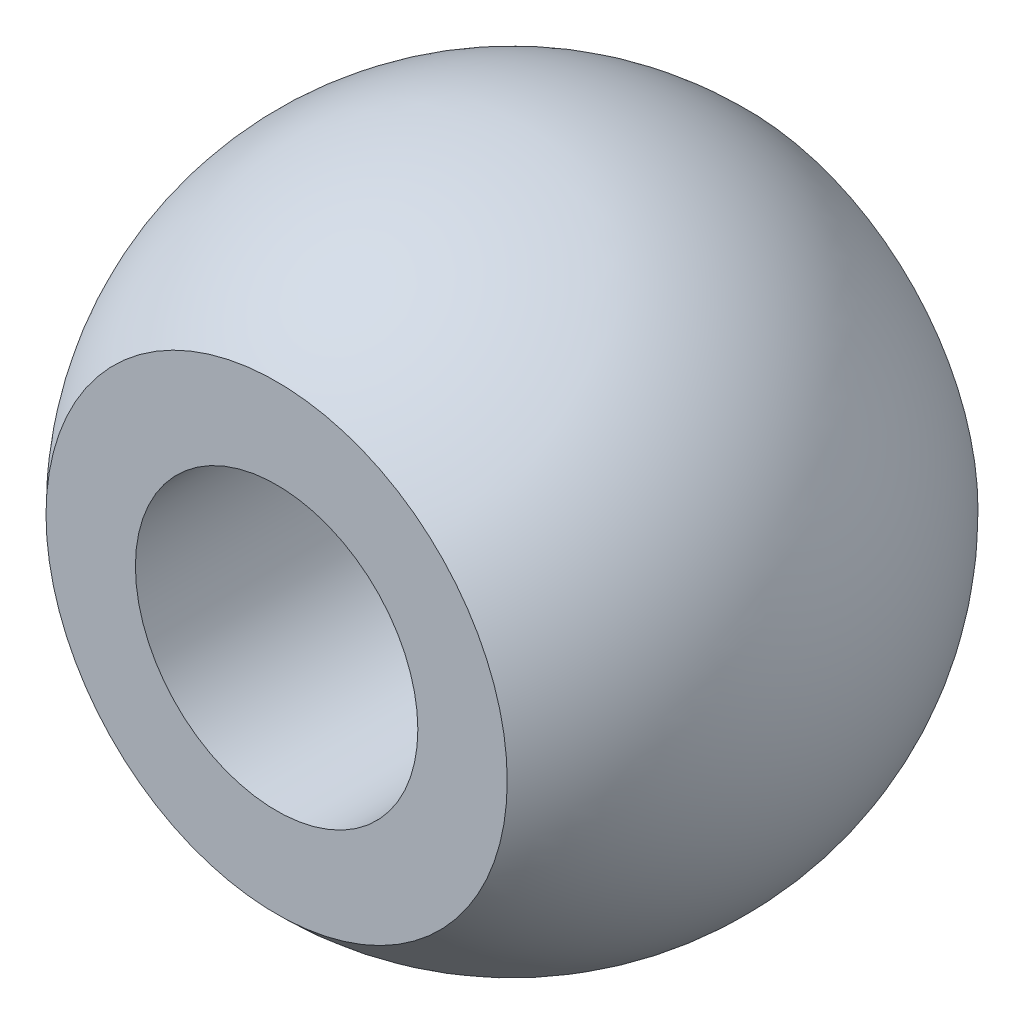
ISO-10303-21;
HEADER;
FILE_DESCRIPTION(('STEP AP214'),'2;1');
FILE_NAME('part.step','',(''),(''),'','','');
FILE_SCHEMA(('AUTOMOTIVE_DESIGN { 1 0 10303 214 1 1 1 1 }'));
ENDSEC;
DATA;
#1=APPLICATION_CONTEXT('core data for automotive mechanical design processes');
#2=APPLICATION_PROTOCOL_DEFINITION('international standard','automotive_design',2000,#1);
#3=PRODUCT_CONTEXT('',#1,'mechanical');
#4=PRODUCT('Part','Part','',(#3));
#5=PRODUCT_RELATED_PRODUCT_CATEGORY('part','',(#4));
#6=PRODUCT_DEFINITION_FORMATION('','',#4);
#7=PRODUCT_DEFINITION_CONTEXT('part definition',#1,'design');
#8=PRODUCT_DEFINITION('design','',#6,#7);
#9=PRODUCT_DEFINITION_SHAPE('','',#8);
#10=(LENGTH_UNIT() NAMED_UNIT(*) SI_UNIT(.MILLI.,.METRE.));
#11=(NAMED_UNIT(*) PLANE_ANGLE_UNIT() SI_UNIT($,.RADIAN.));
#12=(NAMED_UNIT(*) SI_UNIT($,.STERADIAN.) SOLID_ANGLE_UNIT());
#13=UNCERTAINTY_MEASURE_WITH_UNIT(LENGTH_MEASURE(1.E-05),#10,'distance_accuracy_value','');
#14=(GEOMETRIC_REPRESENTATION_CONTEXT(3) GLOBAL_UNCERTAINTY_ASSIGNED_CONTEXT((#13)) GLOBAL_UNIT_ASSIGNED_CONTEXT((#10,
#11,#12)) REPRESENTATION_CONTEXT('',''));
#15=CARTESIAN_POINT('',(0.,0.,0.));
#16=DIRECTION('',(0.,0.,1.));
#17=DIRECTION('',(1.,0.,0.));
#18=AXIS2_PLACEMENT_3D('',#15,#16,#17);
#19=CARTESIAN_POINT('',(0.,0.,0.));
#20=DIRECTION('',(0.,1.,0.));
#21=DIRECTION('',(1.,0.,0.));
#22=AXIS2_PLACEMENT_3D('',#19,#20,#21);
#23=SPHERICAL_SURFACE('',#22,3.5);
#24=CARTESIAN_POINT('',(0.,0.,0.));
#25=DIRECTION('',(0.,0.,1.));
#26=DIRECTION('',(1.,0.,0.));
#27=AXIS2_PLACEMENT_3D('',#24,#25,#26);
#28=SPHERICAL_SURFACE('',#27,3.5);
#29=CARTESIAN_POINT('',(0.,0.,2.5));
#30=DIRECTION('',(0.,0.,1.));
#31=DIRECTION('',(1.,0.,0.));
#32=AXIS2_PLACEMENT_3D('',#29,#30,#31);
#33=CIRCLE('',#32,2.44948974278318);
#34=CARTESIAN_POINT('',(2.44948974278318,0.,2.5));
#35=VERTEX_POINT('',#34);
#36=EDGE_CURVE('E10',#35,#35,#33,.F.);
#37=ORIENTED_EDGE('',*,*,#36,.T.);
#38=EDGE_LOOP('',(#37));
#39=FACE_BOUND('',#38,.T.);
#40=CARTESIAN_POINT('',(0.,0.,-2.5));
#41=DIRECTION('',(0.,0.,-1.));
#42=DIRECTION('',(-1.,0.,0.));
#43=AXIS2_PLACEMENT_3D('',#40,#41,#42);
#44=CIRCLE('',#43,2.44948974278318);
#45=CARTESIAN_POINT('',(-2.44948974278318,0.,-2.5));
#46=VERTEX_POINT('',#45);
#47=EDGE_CURVE('E42',#46,#46,#44,.F.);
#48=ORIENTED_EDGE('',*,*,#47,.T.);
#49=EDGE_LOOP('',(#48));
#50=FACE_BOUND('',#49,.T.);
#51=ADVANCED_FACE('F39',(#39,#50),#28,.T.);
#52=CARTESIAN_POINT('',(0.,0.,2.5));
#53=DIRECTION('',(0.,0.,1.));
#54=DIRECTION('',(1.,0.,0.));
#55=AXIS2_PLACEMENT_3D('',#52,#53,#54);
#56=PLANE('',#55);
#57=CARTESIAN_POINT('',(0.,0.,2.5));
#58=DIRECTION('',(0.,0.,1.));
#59=DIRECTION('',(1.,0.,0.));
#60=AXIS2_PLACEMENT_3D('',#57,#58,#59);
#61=CIRCLE('',#60,1.5);
#62=CARTESIAN_POINT('',(1.5,0.,2.5));
#63=VERTEX_POINT('',#62);
#64=EDGE_CURVE('E53',#63,#63,#61,.T.);
#65=ORIENTED_EDGE('',*,*,#64,.F.);
#66=EDGE_LOOP('',(#65));
#67=FACE_BOUND('',#66,.T.);
#68=ORIENTED_EDGE('',*,*,#36,.F.);
#69=EDGE_LOOP('',(#68));
#70=FACE_BOUND('',#69,.T.);
#71=ADVANCED_FACE('F59',(#67,#70),#56,.T.);
#72=CARTESIAN_POINT('',(0.,0.,-2.5));
#73=DIRECTION('',(0.,0.,-1.));
#74=DIRECTION('',(1.,0.,0.));
#75=AXIS2_PLACEMENT_3D('',#72,#73,#74);
#76=PLANE('',#75);
#77=CARTESIAN_POINT('',(0.,0.,-2.5));
#78=DIRECTION('',(0.,0.,1.));
#79=DIRECTION('',(1.,0.,0.));
#80=AXIS2_PLACEMENT_3D('',#77,#78,#79);
#81=CIRCLE('',#80,1.5);
#82=CARTESIAN_POINT('',(1.5,0.,-2.5));
#83=VERTEX_POINT('',#82);
#84=EDGE_CURVE('E49',#83,#83,#81,.T.);
#85=ORIENTED_EDGE('',*,*,#84,.T.);
#86=EDGE_LOOP('',(#85));
#87=FACE_BOUND('',#86,.T.);
#88=ORIENTED_EDGE('',*,*,#47,.F.);
#89=EDGE_LOOP('',(#88));
#90=FACE_BOUND('',#89,.T.);
#91=ADVANCED_FACE('F62',(#87,#90),#76,.T.);
#92=CARTESIAN_POINT('',(0.,0.,-2.5));
#93=DIRECTION('',(0.,0.,1.));
#94=DIRECTION('',(1.,0.,0.));
#95=AXIS2_PLACEMENT_3D('',#92,#93,#94);
#96=CYLINDRICAL_SURFACE('',#95,1.5);
#97=ORIENTED_EDGE('',*,*,#84,.F.);
#98=EDGE_LOOP('',(#97));
#99=FACE_BOUND('',#98,.T.);
#100=ORIENTED_EDGE('',*,*,#64,.T.);
#101=EDGE_LOOP('',(#100));
#102=FACE_BOUND('',#101,.T.);
#103=ADVANCED_FACE('F57',(#99,#102),#96,.F.);
#104=CLOSED_SHELL('',(#51,#71,#91,#103));
#105=MANIFOLD_SOLID_BREP('B2',#104);
#106=ADVANCED_BREP_SHAPE_REPRESENTATION('',(#18,#105),#14);
#107=SHAPE_DEFINITION_REPRESENTATION(#9,#106);
ENDSEC;
END-ISO-10303-21;
